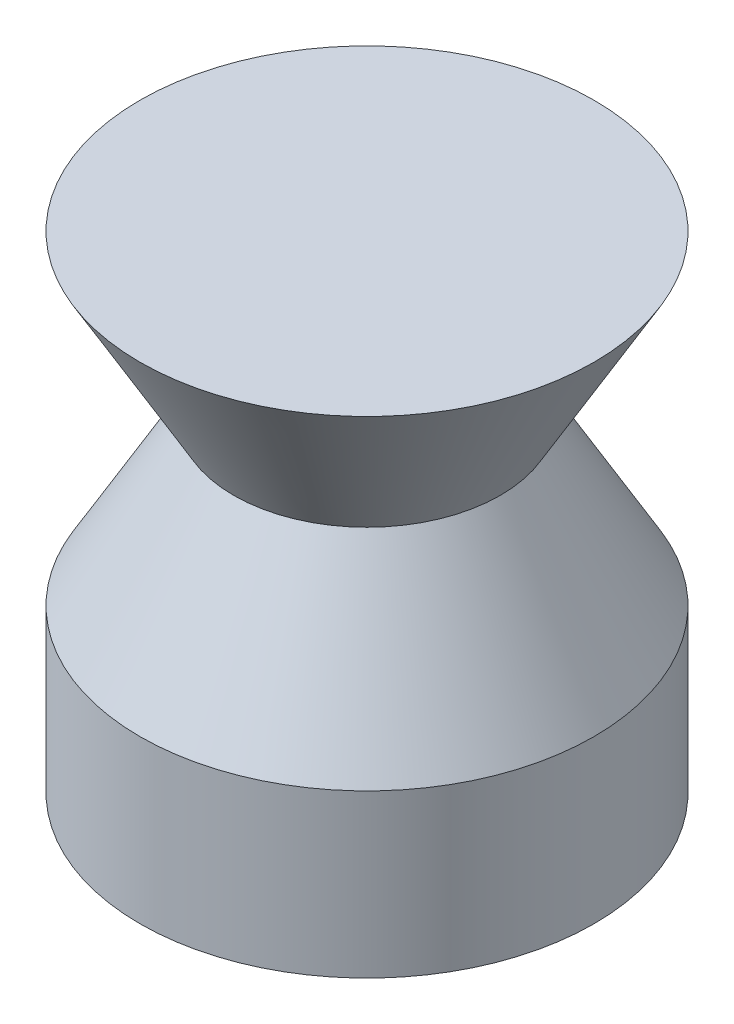
ISO-10303-21;
HEADER;
FILE_DESCRIPTION(('STEP AP214'),'2;1');
FILE_NAME('part.step','',(''),(''),'','','');
FILE_SCHEMA(('AUTOMOTIVE_DESIGN { 1 0 10303 214 1 1 1 1 }'));
ENDSEC;
DATA;
#1=APPLICATION_CONTEXT('core data for automotive mechanical design processes');
#2=APPLICATION_PROTOCOL_DEFINITION('international standard','automotive_design',2000,#1);
#3=PRODUCT_CONTEXT('',#1,'mechanical');
#4=PRODUCT('Part','Part','',(#3));
#5=PRODUCT_RELATED_PRODUCT_CATEGORY('part','',(#4));
#6=PRODUCT_DEFINITION_FORMATION('','',#4);
#7=PRODUCT_DEFINITION_CONTEXT('part definition',#1,'design');
#8=PRODUCT_DEFINITION('design','',#6,#7);
#9=PRODUCT_DEFINITION_SHAPE('','',#8);
#10=(LENGTH_UNIT() NAMED_UNIT(*) SI_UNIT(.MILLI.,.METRE.));
#11=(NAMED_UNIT(*) PLANE_ANGLE_UNIT() SI_UNIT($,.RADIAN.));
#12=(NAMED_UNIT(*) SI_UNIT($,.STERADIAN.) SOLID_ANGLE_UNIT());
#13=UNCERTAINTY_MEASURE_WITH_UNIT(LENGTH_MEASURE(1.E-05),#10,'distance_accuracy_value','');
#14=(GEOMETRIC_REPRESENTATION_CONTEXT(3) GLOBAL_UNCERTAINTY_ASSIGNED_CONTEXT((#13)) GLOBAL_UNIT_ASSIGNED_CONTEXT((#10,
#11,#12)) REPRESENTATION_CONTEXT('',''));
#15=CARTESIAN_POINT('',(0.,0.,0.));
#16=DIRECTION('',(0.,0.,1.));
#17=DIRECTION('',(1.,0.,0.));
#18=AXIS2_PLACEMENT_3D('',#15,#16,#17);
#19=CARTESIAN_POINT('',(-3.20588235294118,0.,-1.57687520208796));
#20=DIRECTION('',(0.,1.,0.));
#21=DIRECTION('',(0.,0.,1.));
#22=AXIS2_PLACEMENT_3D('',#19,#20,#21);
#23=PLANE('',#22);
#24=CARTESIAN_POINT('',(-3.20588235294118,0.,-1.57687520208796));
#25=DIRECTION('',(0.,1.,0.));
#26=DIRECTION('',(0.,0.,1.));
#27=AXIS2_PLACEMENT_3D('',#24,#25,#26);
#28=CIRCLE('',#27,7.);
#29=CARTESIAN_POINT('',(-3.20588235294118,0.,5.42312479791204));
#30=VERTEX_POINT('',#29);
#31=EDGE_CURVE('E37',#30,#30,#28,.T.);
#32=ORIENTED_EDGE('',*,*,#31,.F.);
#33=EDGE_LOOP('',(#32));
#34=FACE_BOUND('',#33,.T.);
#35=DIRECTION('',(0.,0.,1.));
#36=VECTOR('',#35,1.);
#37=CARTESIAN_POINT('',(-4.70588235294118,0.,-4.14705882352941));
#38=LINE('',#37,#36);
#39=CARTESIAN_POINT('',(-4.70588235294118,0.,-4.14705882352941));
#40=VERTEX_POINT('',#39);
#41=CARTESIAN_POINT('',(-4.70588235294118,0.,0.852941176470588));
#42=VERTEX_POINT('',#41);
#43=EDGE_CURVE('E56',#40,#42,#38,.T.);
#44=ORIENTED_EDGE('',*,*,#43,.T.);
#45=DIRECTION('',(1.,0.,0.));
#46=VECTOR('',#45,1.);
#47=CARTESIAN_POINT('',(-4.70588235294118,0.,0.852941176470588));
#48=LINE('',#47,#46);
#49=CARTESIAN_POINT('',(-1.70588235294118,0.,0.852941176470588));
#50=VERTEX_POINT('',#49);
#51=EDGE_CURVE('E105',#42,#50,#48,.T.);
#52=ORIENTED_EDGE('',*,*,#51,.T.);
#53=DIRECTION('',(0.,0.,-1.));
#54=VECTOR('',#53,1.);
#55=CARTESIAN_POINT('',(-1.70588235294118,0.,-4.14705882352941));
#56=LINE('',#55,#54);
#57=CARTESIAN_POINT('',(-1.70588235294118,0.,-4.14705882352941));
#58=VERTEX_POINT('',#57);
#59=EDGE_CURVE('E92',#50,#58,#56,.T.);
#60=ORIENTED_EDGE('',*,*,#59,.T.);
#61=DIRECTION('',(-1.,0.,0.));
#62=VECTOR('',#61,1.);
#63=CARTESIAN_POINT('',(-4.70588235294118,0.,-4.14705882352941));
#64=LINE('',#63,#62);
#65=EDGE_CURVE('E101',#58,#40,#64,.T.);
#66=ORIENTED_EDGE('',*,*,#65,.T.);
#67=EDGE_LOOP('',(#44,#52,#60,#66));
#68=FACE_BOUND('',#67,.T.);
#69=ADVANCED_FACE('F33',(#34,#68),#23,.F.);
#70=CARTESIAN_POINT('',(-3.20588235294118,5.,-1.57687520208796));
#71=DIRECTION('',(0.,-1.,0.));
#72=DIRECTION('',(0.,0.,-1.));
#73=AXIS2_PLACEMENT_3D('',#70,#71,#72);
#74=CYLINDRICAL_SURFACE('',#73,7.);
#75=CARTESIAN_POINT('',(-3.20588235294118,5.,-1.57687520208796));
#76=DIRECTION('',(0.,1.,0.));
#77=DIRECTION('',(0.,0.,1.));
#78=AXIS2_PLACEMENT_3D('',#75,#76,#77);
#79=CIRCLE('',#78,7.);
#80=CARTESIAN_POINT('',(-3.20588235294118,5.,5.42312479791204));
#81=VERTEX_POINT('',#80);
#82=EDGE_CURVE('E11',#81,#81,#79,.T.);
#83=ORIENTED_EDGE('',*,*,#82,.F.);
#84=EDGE_LOOP('',(#83));
#85=FACE_BOUND('',#84,.T.);
#86=ORIENTED_EDGE('',*,*,#31,.T.);
#87=EDGE_LOOP('',(#86));
#88=FACE_BOUND('',#87,.T.);
#89=ADVANCED_FACE('F35',(#85,#88),#74,.T.);
#90=CARTESIAN_POINT('',(-4.70588235294118,5.,-4.14705882352941));
#91=DIRECTION('',(1.,0.,0.));
#92=DIRECTION('',(0.,0.,-1.));
#93=AXIS2_PLACEMENT_3D('',#90,#91,#92);
#94=PLANE('',#93);
#95=ORIENTED_EDGE('',*,*,#43,.F.);
#96=DIRECTION('',(0.,-1.,0.));
#97=VECTOR('',#96,1.);
#98=CARTESIAN_POINT('',(-4.70588235294118,5.,-4.14705882352941));
#99=LINE('',#98,#97);
#100=CARTESIAN_POINT('',(-4.70588235294118,5.,-4.14705882352941));
#101=VERTEX_POINT('',#100);
#102=EDGE_CURVE('E97',#101,#40,#99,.T.);
#103=ORIENTED_EDGE('',*,*,#102,.F.);
#104=DIRECTION('',(0.,0.,1.));
#105=VECTOR('',#104,1.);
#106=CARTESIAN_POINT('',(-4.70588235294118,5.,-4.14705882352941));
#107=LINE('',#106,#105);
#108=CARTESIAN_POINT('',(-4.70588235294118,5.,0.852941176470588));
#109=VERTEX_POINT('',#108);
#110=EDGE_CURVE('E88',#101,#109,#107,.T.);
#111=ORIENTED_EDGE('',*,*,#110,.T.);
#112=DIRECTION('',(0.,-1.,0.));
#113=VECTOR('',#112,1.);
#114=CARTESIAN_POINT('',(-4.70588235294118,5.,0.852941176470588));
#115=LINE('',#114,#113);
#116=EDGE_CURVE('E87',#109,#42,#115,.T.);
#117=ORIENTED_EDGE('',*,*,#116,.T.);
#118=EDGE_LOOP('',(#95,#103,#111,#117));
#119=FACE_BOUND('',#118,.T.);
#120=ADVANCED_FACE('F133',(#119),#94,.T.);
#121=CARTESIAN_POINT('',(-4.70588235294118,5.,0.852941176470588));
#122=DIRECTION('',(0.,0.,-1.));
#123=DIRECTION('',(-1.,0.,0.));
#124=AXIS2_PLACEMENT_3D('',#121,#122,#123);
#125=PLANE('',#124);
#126=ORIENTED_EDGE('',*,*,#51,.F.);
#127=ORIENTED_EDGE('',*,*,#116,.F.);
#128=DIRECTION('',(1.,0.,0.));
#129=VECTOR('',#128,1.);
#130=CARTESIAN_POINT('',(-4.70588235294118,5.,0.852941176470588));
#131=LINE('',#130,#129);
#132=CARTESIAN_POINT('',(-1.70588235294118,5.,0.852941176470588));
#133=VERTEX_POINT('',#132);
#134=EDGE_CURVE('E77',#109,#133,#131,.T.);
#135=ORIENTED_EDGE('',*,*,#134,.T.);
#136=DIRECTION('',(0.,-1.,0.));
#137=VECTOR('',#136,1.);
#138=CARTESIAN_POINT('',(-1.70588235294118,5.,0.852941176470588));
#139=LINE('',#138,#137);
#140=EDGE_CURVE('E85',#133,#50,#139,.T.);
#141=ORIENTED_EDGE('',*,*,#140,.T.);
#142=EDGE_LOOP('',(#126,#127,#135,#141));
#143=FACE_BOUND('',#142,.T.);
#144=ADVANCED_FACE('F84',(#143),#125,.T.);
#145=CARTESIAN_POINT('',(-1.70588235294118,5.,-4.14705882352941));
#146=DIRECTION('',(-1.,0.,0.));
#147=DIRECTION('',(0.,0.,1.));
#148=AXIS2_PLACEMENT_3D('',#145,#146,#147);
#149=PLANE('',#148);
#150=ORIENTED_EDGE('',*,*,#59,.F.);
#151=ORIENTED_EDGE('',*,*,#140,.F.);
#152=DIRECTION('',(0.,0.,-1.));
#153=VECTOR('',#152,1.);
#154=CARTESIAN_POINT('',(-1.70588235294118,5.,-4.14705882352941));
#155=LINE('',#154,#153);
#156=CARTESIAN_POINT('',(-1.70588235294118,5.,-4.14705882352941));
#157=VERTEX_POINT('',#156);
#158=EDGE_CURVE('E74',#133,#157,#155,.T.);
#159=ORIENTED_EDGE('',*,*,#158,.T.);
#160=DIRECTION('',(0.,-1.,0.));
#161=VECTOR('',#160,1.);
#162=CARTESIAN_POINT('',(-1.70588235294118,5.,-4.14705882352941));
#163=LINE('',#162,#161);
#164=EDGE_CURVE('E94',#157,#58,#163,.T.);
#165=ORIENTED_EDGE('',*,*,#164,.T.);
#166=EDGE_LOOP('',(#150,#151,#159,#165));
#167=FACE_BOUND('',#166,.T.);
#168=ADVANCED_FACE('F90',(#167),#149,.T.);
#169=CARTESIAN_POINT('',(-4.70588235294118,5.,-4.14705882352941));
#170=DIRECTION('',(0.,0.,1.));
#171=DIRECTION('',(1.,0.,0.));
#172=AXIS2_PLACEMENT_3D('',#169,#170,#171);
#173=PLANE('',#172);
#174=ORIENTED_EDGE('',*,*,#65,.F.);
#175=ORIENTED_EDGE('',*,*,#164,.F.);
#176=DIRECTION('',(-1.,0.,0.));
#177=VECTOR('',#176,1.);
#178=CARTESIAN_POINT('',(-4.70588235294118,5.,-4.14705882352941));
#179=LINE('',#178,#177);
#180=EDGE_CURVE('E48',#157,#101,#179,.T.);
#181=ORIENTED_EDGE('',*,*,#180,.T.);
#182=ORIENTED_EDGE('',*,*,#102,.T.);
#183=EDGE_LOOP('',(#174,#175,#181,#182));
#184=FACE_BOUND('',#183,.T.);
#185=ADVANCED_FACE('F141',(#184),#173,.T.);
#186=CARTESIAN_POINT('',(-3.20588235294118,5.,-1.57687520208796));
#187=DIRECTION('',(0.,1.,0.));
#188=DIRECTION('',(0.,0.,1.));
#189=AXIS2_PLACEMENT_3D('',#186,#187,#188);
#190=PLANE('',#189);
#191=ORIENTED_EDGE('',*,*,#134,.F.);
#192=ORIENTED_EDGE('',*,*,#110,.F.);
#193=ORIENTED_EDGE('',*,*,#180,.F.);
#194=ORIENTED_EDGE('',*,*,#158,.F.);
#195=EDGE_LOOP('',(#191,#192,#193,#194));
#196=FACE_BOUND('',#195,.T.);
#197=ADVANCED_FACE('F76',(#196),#190,.F.);
#198=CARTESIAN_POINT('',(-3.20588235294118,5.,-1.57687520208796));
#199=DIRECTION('',(0.,-1.,0.));
#200=DIRECTION('',(0.,0.,1.));
#201=AXIS2_PLACEMENT_3D('',#198,#199,#200);
#202=CONICAL_SURFACE('',#201,7.,0.523598775598299);
#203=CARTESIAN_POINT('',(-3.20588235294118,10.,-1.57687520208796));
#204=DIRECTION('',(0.,1.,0.));
#205=DIRECTION('',(0.,0.,1.));
#206=AXIS2_PLACEMENT_3D('',#203,#204,#205);
#207=CIRCLE('',#206,4.11324865405187);
#208=CARTESIAN_POINT('',(-3.20588235294118,10.,2.53637345196391));
#209=VERTEX_POINT('',#208);
#210=EDGE_CURVE('E108',#209,#209,#207,.T.);
#211=ORIENTED_EDGE('',*,*,#210,.F.);
#212=EDGE_LOOP('',(#211));
#213=FACE_BOUND('',#212,.T.);
#214=ORIENTED_EDGE('',*,*,#82,.T.);
#215=EDGE_LOOP('',(#214));
#216=FACE_BOUND('',#215,.T.);
#217=ADVANCED_FACE('F122',(#213,#216),#202,.T.);
#218=CARTESIAN_POINT('',(-3.20588235294118,10.,-1.57687520208796));
#219=DIRECTION('',(0.,1.,0.));
#220=DIRECTION('',(0.,0.,1.));
#221=AXIS2_PLACEMENT_3D('',#218,#219,#220);
#222=CONICAL_SURFACE('',#221,4.11324865405187,0.523598775598299);
#223=CARTESIAN_POINT('',(-3.20588235294118,15.,-1.57687520208796));
#224=DIRECTION('',(0.,1.,0.));
#225=DIRECTION('',(0.,0.,1.));
#226=AXIS2_PLACEMENT_3D('',#223,#224,#225);
#227=CIRCLE('',#226,7.);
#228=CARTESIAN_POINT('',(-3.20588235294118,15.,5.42312479791204));
#229=VERTEX_POINT('',#228);
#230=EDGE_CURVE('E113',#229,#229,#227,.T.);
#231=ORIENTED_EDGE('',*,*,#230,.F.);
#232=EDGE_LOOP('',(#231));
#233=FACE_BOUND('',#232,.T.);
#234=ORIENTED_EDGE('',*,*,#210,.T.);
#235=EDGE_LOOP('',(#234));
#236=FACE_BOUND('',#235,.T.);
#237=ADVANCED_FACE('F119',(#233,#236),#222,.T.);
#238=CARTESIAN_POINT('',(-3.20588235294118,15.,-1.57687520208796));
#239=DIRECTION('',(0.,1.,0.));
#240=DIRECTION('',(0.,0.,1.));
#241=AXIS2_PLACEMENT_3D('',#238,#239,#240);
#242=PLANE('',#241);
#243=ORIENTED_EDGE('',*,*,#230,.T.);
#244=EDGE_LOOP('',(#243));
#245=FACE_BOUND('',#244,.T.);
#246=ADVANCED_FACE('F117',(#245),#242,.T.);
#247=CLOSED_SHELL('',(#69,#89,#120,#144,#168,#185,#197,#217,#237,#246));
#248=MANIFOLD_SOLID_BREP('B2',#247);
#249=ADVANCED_BREP_SHAPE_REPRESENTATION('',(#18,#248),#14);
#250=SHAPE_DEFINITION_REPRESENTATION(#9,#249);
ENDSEC;
END-ISO-10303-21;
